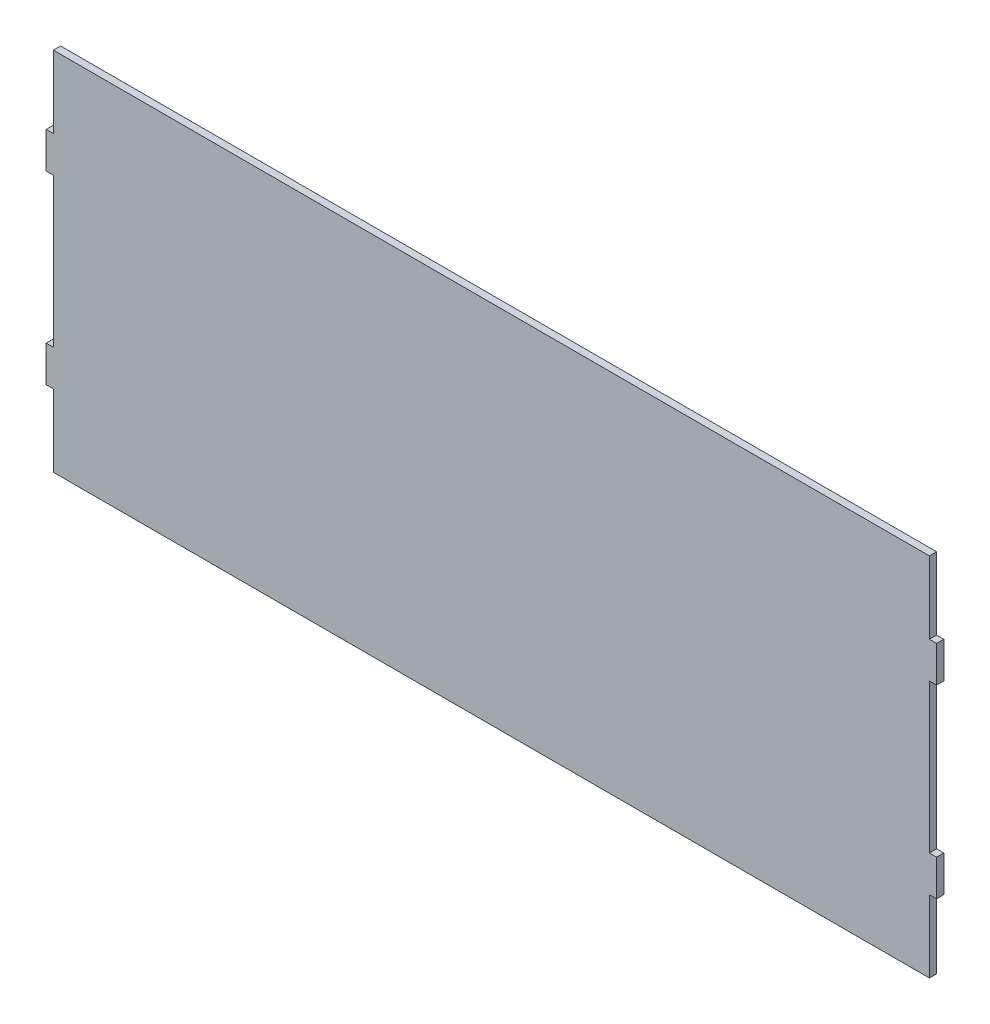
ISO-10303-21;
HEADER;
FILE_DESCRIPTION(('STEP AP214'),'2;1');
FILE_NAME('part.step','',(''),(''),'','','');
FILE_SCHEMA(('AUTOMOTIVE_DESIGN { 1 0 10303 214 1 1 1 1 }'));
ENDSEC;
DATA;
#1=APPLICATION_CONTEXT('core data for automotive mechanical design processes');
#2=APPLICATION_PROTOCOL_DEFINITION('international standard','automotive_design',2000,#1);
#3=PRODUCT_CONTEXT('',#1,'mechanical');
#4=PRODUCT('Part','Part','',(#3));
#5=PRODUCT_RELATED_PRODUCT_CATEGORY('part','',(#4));
#6=PRODUCT_DEFINITION_FORMATION('','',#4);
#7=PRODUCT_DEFINITION_CONTEXT('part definition',#1,'design');
#8=PRODUCT_DEFINITION('design','',#6,#7);
#9=PRODUCT_DEFINITION_SHAPE('','',#8);
#10=(LENGTH_UNIT() NAMED_UNIT(*) SI_UNIT(.MILLI.,.METRE.));
#11=(NAMED_UNIT(*) PLANE_ANGLE_UNIT() SI_UNIT($,.RADIAN.));
#12=(NAMED_UNIT(*) SI_UNIT($,.STERADIAN.) SOLID_ANGLE_UNIT());
#13=UNCERTAINTY_MEASURE_WITH_UNIT(LENGTH_MEASURE(1.E-05),#10,'distance_accuracy_value','');
#14=(GEOMETRIC_REPRESENTATION_CONTEXT(3) GLOBAL_UNCERTAINTY_ASSIGNED_CONTEXT((#13)) GLOBAL_UNIT_ASSIGNED_CONTEXT((#10,
#11,#12)) REPRESENTATION_CONTEXT('',''));
#15=CARTESIAN_POINT('',(0.,0.,0.));
#16=DIRECTION('',(0.,0.,1.));
#17=DIRECTION('',(1.,0.,0.));
#18=AXIS2_PLACEMENT_3D('',#15,#16,#17);
#19=CARTESIAN_POINT('',(0.,0.,3.));
#20=DIRECTION('',(1.,0.,0.));
#21=DIRECTION('',(0.,0.,-1.));
#22=AXIS2_PLACEMENT_3D('',#19,#20,#21);
#23=PLANE('',#22);
#24=DIRECTION('',(0.,-1.,0.));
#25=VECTOR('',#24,1.);
#26=CARTESIAN_POINT('',(0.,0.,0.));
#27=LINE('',#26,#25);
#28=CARTESIAN_POINT('',(0.,29.9999999999999,0.));
#29=VERTEX_POINT('',#28);
#30=CARTESIAN_POINT('',(0.,0.,0.));
#31=VERTEX_POINT('',#30);
#32=EDGE_CURVE('E204',#29,#31,#27,.T.);
#33=ORIENTED_EDGE('',*,*,#32,.T.);
#34=DIRECTION('',(0.,0.,-1.));
#35=VECTOR('',#34,1.);
#36=CARTESIAN_POINT('',(0.,0.,3.));
#37=LINE('',#36,#35);
#38=CARTESIAN_POINT('',(0.,0.,3.));
#39=VERTEX_POINT('',#38);
#40=EDGE_CURVE('E11',#39,#31,#37,.T.);
#41=ORIENTED_EDGE('',*,*,#40,.F.);
#42=DIRECTION('',(0.,-1.,0.));
#43=VECTOR('',#42,1.);
#44=CARTESIAN_POINT('',(0.,0.,3.));
#45=LINE('',#44,#43);
#46=CARTESIAN_POINT('',(0.,29.9999999999999,3.));
#47=VERTEX_POINT('',#46);
#48=EDGE_CURVE('E242',#47,#39,#45,.T.);
#49=ORIENTED_EDGE('',*,*,#48,.F.);
#50=DIRECTION('',(0.,0.,-1.));
#51=VECTOR('',#50,1.);
#52=CARTESIAN_POINT('',(0.,29.9999999999999,3.));
#53=LINE('',#52,#51);
#54=EDGE_CURVE('E200',#47,#29,#53,.T.);
#55=ORIENTED_EDGE('',*,*,#54,.T.);
#56=EDGE_LOOP('',(#33,#41,#49,#55));
#57=FACE_BOUND('',#56,.T.);
#58=ADVANCED_FACE('F36',(#57),#23,.F.);
#59=CARTESIAN_POINT('',(0.,0.,3.));
#60=DIRECTION('',(0.,1.,0.));
#61=DIRECTION('',(-1.,0.,0.));
#62=AXIS2_PLACEMENT_3D('',#59,#60,#61);
#63=PLANE('',#62);
#64=DIRECTION('',(1.,0.,0.));
#65=VECTOR('',#64,1.);
#66=CARTESIAN_POINT('',(0.,0.,0.));
#67=LINE('',#66,#65);
#68=CARTESIAN_POINT('',(364.,0.,0.));
#69=VERTEX_POINT('',#68);
#70=EDGE_CURVE('E207',#31,#69,#67,.T.);
#71=ORIENTED_EDGE('',*,*,#70,.T.);
#72=DIRECTION('',(0.,0.,-1.));
#73=VECTOR('',#72,1.);
#74=CARTESIAN_POINT('',(364.,0.,3.));
#75=LINE('',#74,#73);
#76=CARTESIAN_POINT('',(364.,0.,3.));
#77=VERTEX_POINT('',#76);
#78=EDGE_CURVE('E44',#77,#69,#75,.T.);
#79=ORIENTED_EDGE('',*,*,#78,.F.);
#80=DIRECTION('',(1.,0.,0.));
#81=VECTOR('',#80,1.);
#82=CARTESIAN_POINT('',(0.,0.,3.));
#83=LINE('',#82,#81);
#84=EDGE_CURVE('E131',#39,#77,#83,.T.);
#85=ORIENTED_EDGE('',*,*,#84,.F.);
#86=ORIENTED_EDGE('',*,*,#40,.T.);
#87=EDGE_LOOP('',(#71,#79,#85,#86));
#88=FACE_BOUND('',#87,.T.);
#89=ADVANCED_FACE('F360',(#88),#63,.F.);
#90=CARTESIAN_POINT('',(364.,0.,3.));
#91=DIRECTION('',(-1.,0.,0.));
#92=DIRECTION('',(0.,-1.,0.));
#93=AXIS2_PLACEMENT_3D('',#90,#91,#92);
#94=PLANE('',#93);
#95=DIRECTION('',(0.,1.,0.));
#96=VECTOR('',#95,1.);
#97=CARTESIAN_POINT('',(364.,0.,0.));
#98=LINE('',#97,#96);
#99=CARTESIAN_POINT('',(364.,29.9999999999999,0.));
#100=VERTEX_POINT('',#99);
#101=EDGE_CURVE('E209',#69,#100,#98,.T.);
#102=ORIENTED_EDGE('',*,*,#101,.T.);
#103=DIRECTION('',(0.,0.,-1.));
#104=VECTOR('',#103,1.);
#105=CARTESIAN_POINT('',(364.,29.9999999999999,3.));
#106=LINE('',#105,#104);
#107=CARTESIAN_POINT('',(364.,29.9999999999999,3.));
#108=VERTEX_POINT('',#107);
#109=EDGE_CURVE('E285',#108,#100,#106,.T.);
#110=ORIENTED_EDGE('',*,*,#109,.F.);
#111=DIRECTION('',(0.,1.,0.));
#112=VECTOR('',#111,1.);
#113=CARTESIAN_POINT('',(364.,0.,3.));
#114=LINE('',#113,#112);
#115=EDGE_CURVE('E293',#77,#108,#114,.T.);
#116=ORIENTED_EDGE('',*,*,#115,.F.);
#117=ORIENTED_EDGE('',*,*,#78,.T.);
#118=EDGE_LOOP('',(#102,#110,#116,#117));
#119=FACE_BOUND('',#118,.T.);
#120=ADVANCED_FACE('F291',(#119),#94,.F.);
#121=CARTESIAN_POINT('',(364.,29.9999999999999,3.));
#122=DIRECTION('',(0.,1.,0.));
#123=DIRECTION('',(0.,0.,1.));
#124=AXIS2_PLACEMENT_3D('',#121,#122,#123);
#125=PLANE('',#124);
#126=DIRECTION('',(1.,0.,0.));
#127=VECTOR('',#126,1.);
#128=CARTESIAN_POINT('',(364.,29.9999999999999,0.));
#129=LINE('',#128,#127);
#130=CARTESIAN_POINT('',(367.,29.9999999999999,0.));
#131=VERTEX_POINT('',#130);
#132=EDGE_CURVE('E211',#100,#131,#129,.T.);
#133=ORIENTED_EDGE('',*,*,#132,.T.);
#134=DIRECTION('',(0.,0.,-1.));
#135=VECTOR('',#134,1.);
#136=CARTESIAN_POINT('',(367.,29.9999999999999,3.));
#137=LINE('',#136,#135);
#138=CARTESIAN_POINT('',(367.,29.9999999999999,3.));
#139=VERTEX_POINT('',#138);
#140=EDGE_CURVE('E282',#139,#131,#137,.T.);
#141=ORIENTED_EDGE('',*,*,#140,.F.);
#142=DIRECTION('',(1.,0.,0.));
#143=VECTOR('',#142,1.);
#144=CARTESIAN_POINT('',(364.,29.9999999999999,3.));
#145=LINE('',#144,#143);
#146=EDGE_CURVE('E311',#108,#139,#145,.T.);
#147=ORIENTED_EDGE('',*,*,#146,.F.);
#148=ORIENTED_EDGE('',*,*,#109,.T.);
#149=EDGE_LOOP('',(#133,#141,#147,#148));
#150=FACE_BOUND('',#149,.T.);
#151=ADVANCED_FACE('F302',(#150),#125,.F.);
#152=CARTESIAN_POINT('',(367.,29.9999999999999,3.));
#153=DIRECTION('',(-1.,0.,0.));
#154=DIRECTION('',(0.,0.,1.));
#155=AXIS2_PLACEMENT_3D('',#152,#153,#154);
#156=PLANE('',#155);
#157=DIRECTION('',(0.,1.,0.));
#158=VECTOR('',#157,1.);
#159=CARTESIAN_POINT('',(367.,29.9999999999999,0.));
#160=LINE('',#159,#158);
#161=CARTESIAN_POINT('',(367.,44.9999999999999,0.));
#162=VERTEX_POINT('',#161);
#163=EDGE_CURVE('E213',#131,#162,#160,.T.);
#164=ORIENTED_EDGE('',*,*,#163,.T.);
#165=DIRECTION('',(0.,0.,-1.));
#166=VECTOR('',#165,1.);
#167=CARTESIAN_POINT('',(367.,44.9999999999999,3.));
#168=LINE('',#167,#166);
#169=CARTESIAN_POINT('',(367.,44.9999999999999,3.));
#170=VERTEX_POINT('',#169);
#171=EDGE_CURVE('E279',#170,#162,#168,.T.);
#172=ORIENTED_EDGE('',*,*,#171,.F.);
#173=DIRECTION('',(0.,1.,0.));
#174=VECTOR('',#173,1.);
#175=CARTESIAN_POINT('',(367.,29.9999999999999,3.));
#176=LINE('',#175,#174);
#177=EDGE_CURVE('E308',#139,#170,#176,.T.);
#178=ORIENTED_EDGE('',*,*,#177,.F.);
#179=ORIENTED_EDGE('',*,*,#140,.T.);
#180=EDGE_LOOP('',(#164,#172,#178,#179));
#181=FACE_BOUND('',#180,.T.);
#182=ADVANCED_FACE('F306',(#181),#156,.F.);
#183=CARTESIAN_POINT('',(367.,44.9999999999999,3.));
#184=DIRECTION('',(0.,-1.,0.));
#185=DIRECTION('',(0.,0.,-1.));
#186=AXIS2_PLACEMENT_3D('',#183,#184,#185);
#187=PLANE('',#186);
#188=DIRECTION('',(-1.,0.,0.));
#189=VECTOR('',#188,1.);
#190=CARTESIAN_POINT('',(367.,44.9999999999999,0.));
#191=LINE('',#190,#189);
#192=CARTESIAN_POINT('',(364.,44.9999999999999,0.));
#193=VERTEX_POINT('',#192);
#194=EDGE_CURVE('E215',#162,#193,#191,.T.);
#195=ORIENTED_EDGE('',*,*,#194,.T.);
#196=DIRECTION('',(0.,0.,-1.));
#197=VECTOR('',#196,1.);
#198=CARTESIAN_POINT('',(364.,44.9999999999999,3.));
#199=LINE('',#198,#197);
#200=CARTESIAN_POINT('',(364.,44.9999999999999,3.));
#201=VERTEX_POINT('',#200);
#202=EDGE_CURVE('E276',#201,#193,#199,.T.);
#203=ORIENTED_EDGE('',*,*,#202,.F.);
#204=DIRECTION('',(-1.,0.,0.));
#205=VECTOR('',#204,1.);
#206=CARTESIAN_POINT('',(367.,44.9999999999999,3.));
#207=LINE('',#206,#205);
#208=EDGE_CURVE('E310',#170,#201,#207,.T.);
#209=ORIENTED_EDGE('',*,*,#208,.F.);
#210=ORIENTED_EDGE('',*,*,#171,.T.);
#211=EDGE_LOOP('',(#195,#203,#209,#210));
#212=FACE_BOUND('',#211,.T.);
#213=ADVANCED_FACE('F373',(#212),#187,.F.);
#214=CARTESIAN_POINT('',(364.,44.9999999999999,3.));
#215=DIRECTION('',(-1.,0.,0.));
#216=DIRECTION('',(0.,0.,1.));
#217=AXIS2_PLACEMENT_3D('',#214,#215,#216);
#218=PLANE('',#217);
#219=DIRECTION('',(0.,1.,0.));
#220=VECTOR('',#219,1.);
#221=CARTESIAN_POINT('',(364.,44.9999999999999,0.));
#222=LINE('',#221,#220);
#223=CARTESIAN_POINT('',(364.,106.91,0.));
#224=VERTEX_POINT('',#223);
#225=EDGE_CURVE('E217',#193,#224,#222,.T.);
#226=ORIENTED_EDGE('',*,*,#225,.T.);
#227=DIRECTION('',(0.,0.,-1.));
#228=VECTOR('',#227,1.);
#229=CARTESIAN_POINT('',(364.,106.91,3.));
#230=LINE('',#229,#228);
#231=CARTESIAN_POINT('',(364.,106.91,3.));
#232=VERTEX_POINT('',#231);
#233=EDGE_CURVE('E273',#232,#224,#230,.T.);
#234=ORIENTED_EDGE('',*,*,#233,.F.);
#235=DIRECTION('',(0.,1.,0.));
#236=VECTOR('',#235,1.);
#237=CARTESIAN_POINT('',(364.,44.9999999999999,3.));
#238=LINE('',#237,#236);
#239=EDGE_CURVE('E313',#201,#232,#238,.T.);
#240=ORIENTED_EDGE('',*,*,#239,.F.);
#241=ORIENTED_EDGE('',*,*,#202,.T.);
#242=EDGE_LOOP('',(#226,#234,#240,#241));
#243=FACE_BOUND('',#242,.T.);
#244=ADVANCED_FACE('F376',(#243),#218,.F.);
#245=CARTESIAN_POINT('',(367.,106.91,3.));
#246=DIRECTION('',(0.,1.,0.));
#247=DIRECTION('',(0.,0.,1.));
#248=AXIS2_PLACEMENT_3D('',#245,#246,#247);
#249=PLANE('',#248);
#250=DIRECTION('',(1.,0.,0.));
#251=VECTOR('',#250,1.);
#252=CARTESIAN_POINT('',(367.,106.91,0.));
#253=LINE('',#252,#251);
#254=CARTESIAN_POINT('',(367.,106.91,0.));
#255=VERTEX_POINT('',#254);
#256=EDGE_CURVE('E219',#224,#255,#253,.T.);
#257=ORIENTED_EDGE('',*,*,#256,.T.);
#258=DIRECTION('',(0.,0.,-1.));
#259=VECTOR('',#258,1.);
#260=CARTESIAN_POINT('',(367.,106.91,3.));
#261=LINE('',#260,#259);
#262=CARTESIAN_POINT('',(367.,106.91,3.));
#263=VERTEX_POINT('',#262);
#264=EDGE_CURVE('E270',#263,#255,#261,.T.);
#265=ORIENTED_EDGE('',*,*,#264,.F.);
#266=DIRECTION('',(1.,0.,0.));
#267=VECTOR('',#266,1.);
#268=CARTESIAN_POINT('',(367.,106.91,3.));
#269=LINE('',#268,#267);
#270=EDGE_CURVE('E319',#232,#263,#269,.T.);
#271=ORIENTED_EDGE('',*,*,#270,.F.);
#272=ORIENTED_EDGE('',*,*,#233,.T.);
#273=EDGE_LOOP('',(#257,#265,#271,#272));
#274=FACE_BOUND('',#273,.T.);
#275=ADVANCED_FACE('F380',(#274),#249,.F.);
#276=CARTESIAN_POINT('',(367.,121.91,3.));
#277=DIRECTION('',(-1.,0.,0.));
#278=DIRECTION('',(0.,0.,1.));
#279=AXIS2_PLACEMENT_3D('',#276,#277,#278);
#280=PLANE('',#279);
#281=DIRECTION('',(0.,1.,0.));
#282=VECTOR('',#281,1.);
#283=CARTESIAN_POINT('',(367.,121.91,0.));
#284=LINE('',#283,#282);
#285=CARTESIAN_POINT('',(367.,121.91,0.));
#286=VERTEX_POINT('',#285);
#287=EDGE_CURVE('E221',#255,#286,#284,.T.);
#288=ORIENTED_EDGE('',*,*,#287,.T.);
#289=DIRECTION('',(0.,0.,-1.));
#290=VECTOR('',#289,1.);
#291=CARTESIAN_POINT('',(367.,121.91,3.));
#292=LINE('',#291,#290);
#293=CARTESIAN_POINT('',(367.,121.91,3.));
#294=VERTEX_POINT('',#293);
#295=EDGE_CURVE('E267',#294,#286,#292,.T.);
#296=ORIENTED_EDGE('',*,*,#295,.F.);
#297=DIRECTION('',(0.,1.,0.));
#298=VECTOR('',#297,1.);
#299=CARTESIAN_POINT('',(367.,121.91,3.));
#300=LINE('',#299,#298);
#301=EDGE_CURVE('E321',#263,#294,#300,.T.);
#302=ORIENTED_EDGE('',*,*,#301,.F.);
#303=ORIENTED_EDGE('',*,*,#264,.T.);
#304=EDGE_LOOP('',(#288,#296,#302,#303));
#305=FACE_BOUND('',#304,.T.);
#306=ADVANCED_FACE('F384',(#305),#280,.F.);
#307=CARTESIAN_POINT('',(364.,121.91,3.));
#308=DIRECTION('',(0.,-1.,0.));
#309=DIRECTION('',(0.,0.,-1.));
#310=AXIS2_PLACEMENT_3D('',#307,#308,#309);
#311=PLANE('',#310);
#312=DIRECTION('',(-1.,0.,0.));
#313=VECTOR('',#312,1.);
#314=CARTESIAN_POINT('',(364.,121.91,0.));
#315=LINE('',#314,#313);
#316=CARTESIAN_POINT('',(364.,121.91,0.));
#317=VERTEX_POINT('',#316);
#318=EDGE_CURVE('E223',#286,#317,#315,.T.);
#319=ORIENTED_EDGE('',*,*,#318,.T.);
#320=DIRECTION('',(0.,0.,-1.));
#321=VECTOR('',#320,1.);
#322=CARTESIAN_POINT('',(364.,121.91,3.));
#323=LINE('',#322,#321);
#324=CARTESIAN_POINT('',(364.,121.91,3.));
#325=VERTEX_POINT('',#324);
#326=EDGE_CURVE('E264',#325,#317,#323,.T.);
#327=ORIENTED_EDGE('',*,*,#326,.F.);
#328=DIRECTION('',(-1.,0.,0.));
#329=VECTOR('',#328,1.);
#330=CARTESIAN_POINT('',(364.,121.91,3.));
#331=LINE('',#330,#329);
#332=EDGE_CURVE('E323',#294,#325,#331,.T.);
#333=ORIENTED_EDGE('',*,*,#332,.F.);
#334=ORIENTED_EDGE('',*,*,#295,.T.);
#335=EDGE_LOOP('',(#319,#327,#333,#334));
#336=FACE_BOUND('',#335,.T.);
#337=ADVANCED_FACE('F388',(#336),#311,.F.);
#338=CARTESIAN_POINT('',(364.,121.91,3.));
#339=DIRECTION('',(-1.,0.,0.));
#340=DIRECTION('',(0.,-1.,0.));
#341=AXIS2_PLACEMENT_3D('',#338,#339,#340);
#342=PLANE('',#341);
#343=DIRECTION('',(0.,1.,0.));
#344=VECTOR('',#343,1.);
#345=CARTESIAN_POINT('',(364.,121.91,0.));
#346=LINE('',#345,#344);
#347=CARTESIAN_POINT('',(364.,151.91,0.));
#348=VERTEX_POINT('',#347);
#349=EDGE_CURVE('E225',#317,#348,#346,.T.);
#350=ORIENTED_EDGE('',*,*,#349,.T.);
#351=DIRECTION('',(0.,0.,-1.));
#352=VECTOR('',#351,1.);
#353=CARTESIAN_POINT('',(364.,151.91,3.));
#354=LINE('',#353,#352);
#355=CARTESIAN_POINT('',(364.,151.91,3.));
#356=VERTEX_POINT('',#355);
#357=EDGE_CURVE('E261',#356,#348,#354,.T.);
#358=ORIENTED_EDGE('',*,*,#357,.F.);
#359=DIRECTION('',(0.,1.,0.));
#360=VECTOR('',#359,1.);
#361=CARTESIAN_POINT('',(364.,121.91,3.));
#362=LINE('',#361,#360);
#363=EDGE_CURVE('E325',#325,#356,#362,.T.);
#364=ORIENTED_EDGE('',*,*,#363,.F.);
#365=ORIENTED_EDGE('',*,*,#326,.T.);
#366=EDGE_LOOP('',(#350,#358,#364,#365));
#367=FACE_BOUND('',#366,.T.);
#368=ADVANCED_FACE('F392',(#367),#342,.F.);
#369=CARTESIAN_POINT('',(0.,151.91,3.));
#370=DIRECTION('',(0.,-1.,0.));
#371=DIRECTION('',(1.,0.,0.));
#372=AXIS2_PLACEMENT_3D('',#369,#370,#371);
#373=PLANE('',#372);
#374=DIRECTION('',(-1.,0.,0.));
#375=VECTOR('',#374,1.);
#376=CARTESIAN_POINT('',(0.,151.91,0.));
#377=LINE('',#376,#375);
#378=CARTESIAN_POINT('',(0.,151.91,0.));
#379=VERTEX_POINT('',#378);
#380=EDGE_CURVE('E227',#348,#379,#377,.T.);
#381=ORIENTED_EDGE('',*,*,#380,.T.);
#382=DIRECTION('',(0.,0.,-1.));
#383=VECTOR('',#382,1.);
#384=CARTESIAN_POINT('',(0.,151.91,3.));
#385=LINE('',#384,#383);
#386=CARTESIAN_POINT('',(0.,151.91,3.));
#387=VERTEX_POINT('',#386);
#388=EDGE_CURVE('E258',#387,#379,#385,.T.);
#389=ORIENTED_EDGE('',*,*,#388,.F.);
#390=DIRECTION('',(-1.,0.,0.));
#391=VECTOR('',#390,1.);
#392=CARTESIAN_POINT('',(0.,151.91,3.));
#393=LINE('',#392,#391);
#394=EDGE_CURVE('E327',#356,#387,#393,.T.);
#395=ORIENTED_EDGE('',*,*,#394,.F.);
#396=ORIENTED_EDGE('',*,*,#357,.T.);
#397=EDGE_LOOP('',(#381,#389,#395,#396));
#398=FACE_BOUND('',#397,.T.);
#399=ADVANCED_FACE('F396',(#398),#373,.F.);
#400=CARTESIAN_POINT('',(0.,121.91,3.));
#401=DIRECTION('',(1.,0.,0.));
#402=DIRECTION('',(0.,0.,-1.));
#403=AXIS2_PLACEMENT_3D('',#400,#401,#402);
#404=PLANE('',#403);
#405=DIRECTION('',(0.,-1.,0.));
#406=VECTOR('',#405,1.);
#407=CARTESIAN_POINT('',(0.,121.91,0.));
#408=LINE('',#407,#406);
#409=CARTESIAN_POINT('',(0.,121.91,0.));
#410=VERTEX_POINT('',#409);
#411=EDGE_CURVE('E229',#379,#410,#408,.T.);
#412=ORIENTED_EDGE('',*,*,#411,.T.);
#413=DIRECTION('',(0.,0.,-1.));
#414=VECTOR('',#413,1.);
#415=CARTESIAN_POINT('',(0.,121.91,3.));
#416=LINE('',#415,#414);
#417=CARTESIAN_POINT('',(0.,121.91,3.));
#418=VERTEX_POINT('',#417);
#419=EDGE_CURVE('E255',#418,#410,#416,.T.);
#420=ORIENTED_EDGE('',*,*,#419,.F.);
#421=DIRECTION('',(0.,-1.,0.));
#422=VECTOR('',#421,1.);
#423=CARTESIAN_POINT('',(0.,121.91,3.));
#424=LINE('',#423,#422);
#425=EDGE_CURVE('E329',#387,#418,#424,.T.);
#426=ORIENTED_EDGE('',*,*,#425,.F.);
#427=ORIENTED_EDGE('',*,*,#388,.T.);
#428=EDGE_LOOP('',(#412,#420,#426,#427));
#429=FACE_BOUND('',#428,.T.);
#430=ADVANCED_FACE('F400',(#429),#404,.F.);
#431=CARTESIAN_POINT('',(0.,121.91,3.));
#432=DIRECTION('',(0.,-1.,0.));
#433=DIRECTION('',(0.,0.,-1.));
#434=AXIS2_PLACEMENT_3D('',#431,#432,#433);
#435=PLANE('',#434);
#436=DIRECTION('',(-1.,0.,0.));
#437=VECTOR('',#436,1.);
#438=CARTESIAN_POINT('',(0.,121.91,0.));
#439=LINE('',#438,#437);
#440=CARTESIAN_POINT('',(-3.,121.91,0.));
#441=VERTEX_POINT('',#440);
#442=EDGE_CURVE('E231',#410,#441,#439,.T.);
#443=ORIENTED_EDGE('',*,*,#442,.T.);
#444=DIRECTION('',(0.,0.,-1.));
#445=VECTOR('',#444,1.);
#446=CARTESIAN_POINT('',(-3.,121.91,3.));
#447=LINE('',#446,#445);
#448=CARTESIAN_POINT('',(-3.,121.91,3.));
#449=VERTEX_POINT('',#448);
#450=EDGE_CURVE('E252',#449,#441,#447,.T.);
#451=ORIENTED_EDGE('',*,*,#450,.F.);
#452=DIRECTION('',(-1.,0.,0.));
#453=VECTOR('',#452,1.);
#454=CARTESIAN_POINT('',(0.,121.91,3.));
#455=LINE('',#454,#453);
#456=EDGE_CURVE('E331',#418,#449,#455,.T.);
#457=ORIENTED_EDGE('',*,*,#456,.F.);
#458=ORIENTED_EDGE('',*,*,#419,.T.);
#459=EDGE_LOOP('',(#443,#451,#457,#458));
#460=FACE_BOUND('',#459,.T.);
#461=ADVANCED_FACE('F404',(#460),#435,.F.);
#462=CARTESIAN_POINT('',(-3.,121.91,3.));
#463=DIRECTION('',(1.,0.,0.));
#464=DIRECTION('',(0.,0.,-1.));
#465=AXIS2_PLACEMENT_3D('',#462,#463,#464);
#466=PLANE('',#465);
#467=DIRECTION('',(0.,-1.,0.));
#468=VECTOR('',#467,1.);
#469=CARTESIAN_POINT('',(-3.,121.91,0.));
#470=LINE('',#469,#468);
#471=CARTESIAN_POINT('',(-3.,106.91,0.));
#472=VERTEX_POINT('',#471);
#473=EDGE_CURVE('E233',#441,#472,#470,.T.);
#474=ORIENTED_EDGE('',*,*,#473,.T.);
#475=DIRECTION('',(0.,0.,-1.));
#476=VECTOR('',#475,1.);
#477=CARTESIAN_POINT('',(-3.,106.91,3.));
#478=LINE('',#477,#476);
#479=CARTESIAN_POINT('',(-3.,106.91,3.));
#480=VERTEX_POINT('',#479);
#481=EDGE_CURVE('E249',#480,#472,#478,.T.);
#482=ORIENTED_EDGE('',*,*,#481,.F.);
#483=DIRECTION('',(0.,-1.,0.));
#484=VECTOR('',#483,1.);
#485=CARTESIAN_POINT('',(-3.,121.91,3.));
#486=LINE('',#485,#484);
#487=EDGE_CURVE('E333',#449,#480,#486,.T.);
#488=ORIENTED_EDGE('',*,*,#487,.F.);
#489=ORIENTED_EDGE('',*,*,#450,.T.);
#490=EDGE_LOOP('',(#474,#482,#488,#489));
#491=FACE_BOUND('',#490,.T.);
#492=ADVANCED_FACE('F408',(#491),#466,.F.);
#493=CARTESIAN_POINT('',(-3.,106.91,3.));
#494=DIRECTION('',(0.,1.,0.));
#495=DIRECTION('',(0.,0.,1.));
#496=AXIS2_PLACEMENT_3D('',#493,#494,#495);
#497=PLANE('',#496);
#498=DIRECTION('',(1.,0.,0.));
#499=VECTOR('',#498,1.);
#500=CARTESIAN_POINT('',(-3.,106.91,0.));
#501=LINE('',#500,#499);
#502=CARTESIAN_POINT('',(0.,106.91,0.));
#503=VERTEX_POINT('',#502);
#504=EDGE_CURVE('E235',#472,#503,#501,.T.);
#505=ORIENTED_EDGE('',*,*,#504,.T.);
#506=DIRECTION('',(0.,0.,-1.));
#507=VECTOR('',#506,1.);
#508=CARTESIAN_POINT('',(0.,106.91,3.));
#509=LINE('',#508,#507);
#510=CARTESIAN_POINT('',(0.,106.91,3.));
#511=VERTEX_POINT('',#510);
#512=EDGE_CURVE('E246',#511,#503,#509,.T.);
#513=ORIENTED_EDGE('',*,*,#512,.F.);
#514=DIRECTION('',(1.,0.,0.));
#515=VECTOR('',#514,1.);
#516=CARTESIAN_POINT('',(-3.,106.91,3.));
#517=LINE('',#516,#515);
#518=EDGE_CURVE('E335',#480,#511,#517,.T.);
#519=ORIENTED_EDGE('',*,*,#518,.F.);
#520=ORIENTED_EDGE('',*,*,#481,.T.);
#521=EDGE_LOOP('',(#505,#513,#519,#520));
#522=FACE_BOUND('',#521,.T.);
#523=ADVANCED_FACE('F341',(#522),#497,.F.);
#524=CARTESIAN_POINT('',(0.,44.9999999999999,3.));
#525=DIRECTION('',(1.,0.,0.));
#526=DIRECTION('',(0.,0.,-1.));
#527=AXIS2_PLACEMENT_3D('',#524,#525,#526);
#528=PLANE('',#527);
#529=DIRECTION('',(0.,-1.,0.));
#530=VECTOR('',#529,1.);
#531=CARTESIAN_POINT('',(0.,44.9999999999999,0.));
#532=LINE('',#531,#530);
#533=CARTESIAN_POINT('',(0.,44.9999999999999,0.));
#534=VERTEX_POINT('',#533);
#535=EDGE_CURVE('E237',#503,#534,#532,.T.);
#536=ORIENTED_EDGE('',*,*,#535,.T.);
#537=DIRECTION('',(0.,0.,-1.));
#538=VECTOR('',#537,1.);
#539=CARTESIAN_POINT('',(0.,44.9999999999999,3.));
#540=LINE('',#539,#538);
#541=CARTESIAN_POINT('',(0.,44.9999999999999,3.));
#542=VERTEX_POINT('',#541);
#543=EDGE_CURVE('E195',#542,#534,#540,.T.);
#544=ORIENTED_EDGE('',*,*,#543,.F.);
#545=DIRECTION('',(0.,-1.,0.));
#546=VECTOR('',#545,1.);
#547=CARTESIAN_POINT('',(0.,44.9999999999999,3.));
#548=LINE('',#547,#546);
#549=EDGE_CURVE('E186',#511,#542,#548,.T.);
#550=ORIENTED_EDGE('',*,*,#549,.F.);
#551=ORIENTED_EDGE('',*,*,#512,.T.);
#552=EDGE_LOOP('',(#536,#544,#550,#551));
#553=FACE_BOUND('',#552,.T.);
#554=ADVANCED_FACE('F345',(#553),#528,.F.);
#555=CARTESIAN_POINT('',(-3.,44.9999999999999,3.));
#556=DIRECTION('',(0.,-1.,0.));
#557=DIRECTION('',(0.,0.,-1.));
#558=AXIS2_PLACEMENT_3D('',#555,#556,#557);
#559=PLANE('',#558);
#560=DIRECTION('',(-1.,0.,0.));
#561=VECTOR('',#560,1.);
#562=CARTESIAN_POINT('',(-3.,44.9999999999999,0.));
#563=LINE('',#562,#561);
#564=CARTESIAN_POINT('',(-3.,44.9999999999999,0.));
#565=VERTEX_POINT('',#564);
#566=EDGE_CURVE('E194',#534,#565,#563,.T.);
#567=ORIENTED_EDGE('',*,*,#566,.T.);
#568=DIRECTION('',(0.,0.,-1.));
#569=VECTOR('',#568,1.);
#570=CARTESIAN_POINT('',(-3.,44.9999999999999,3.));
#571=LINE('',#570,#569);
#572=CARTESIAN_POINT('',(-3.,44.9999999999999,3.));
#573=VERTEX_POINT('',#572);
#574=EDGE_CURVE('E191',#573,#565,#571,.T.);
#575=ORIENTED_EDGE('',*,*,#574,.F.);
#576=DIRECTION('',(-1.,0.,0.));
#577=VECTOR('',#576,1.);
#578=CARTESIAN_POINT('',(-3.,44.9999999999999,3.));
#579=LINE('',#578,#577);
#580=EDGE_CURVE('E180',#542,#573,#579,.T.);
#581=ORIENTED_EDGE('',*,*,#580,.F.);
#582=ORIENTED_EDGE('',*,*,#543,.T.);
#583=EDGE_LOOP('',(#567,#575,#581,#582));
#584=FACE_BOUND('',#583,.T.);
#585=ADVANCED_FACE('F192',(#584),#559,.F.);
#586=CARTESIAN_POINT('',(-3.,29.9999999999999,3.));
#587=DIRECTION('',(1.,0.,0.));
#588=DIRECTION('',(0.,0.,-1.));
#589=AXIS2_PLACEMENT_3D('',#586,#587,#588);
#590=PLANE('',#589);
#591=DIRECTION('',(0.,-1.,0.));
#592=VECTOR('',#591,1.);
#593=CARTESIAN_POINT('',(-3.,29.9999999999999,0.));
#594=LINE('',#593,#592);
#595=CARTESIAN_POINT('',(-3.,29.9999999999999,0.));
#596=VERTEX_POINT('',#595);
#597=EDGE_CURVE('E117',#565,#596,#594,.T.);
#598=ORIENTED_EDGE('',*,*,#597,.T.);
#599=DIRECTION('',(0.,0.,-1.));
#600=VECTOR('',#599,1.);
#601=CARTESIAN_POINT('',(-3.,29.9999999999999,3.));
#602=LINE('',#601,#600);
#603=CARTESIAN_POINT('',(-3.,29.9999999999999,3.));
#604=VERTEX_POINT('',#603);
#605=EDGE_CURVE('E196',#604,#596,#602,.T.);
#606=ORIENTED_EDGE('',*,*,#605,.F.);
#607=DIRECTION('',(0.,-1.,0.));
#608=VECTOR('',#607,1.);
#609=CARTESIAN_POINT('',(-3.,29.9999999999999,3.));
#610=LINE('',#609,#608);
#611=EDGE_CURVE('E184',#573,#604,#610,.T.);
#612=ORIENTED_EDGE('',*,*,#611,.F.);
#613=ORIENTED_EDGE('',*,*,#574,.T.);
#614=EDGE_LOOP('',(#598,#606,#612,#613));
#615=FACE_BOUND('',#614,.T.);
#616=ADVANCED_FACE('F198',(#615),#590,.F.);
#617=CARTESIAN_POINT('',(0.,29.9999999999999,3.));
#618=DIRECTION('',(0.,1.,0.));
#619=DIRECTION('',(0.,0.,1.));
#620=AXIS2_PLACEMENT_3D('',#617,#618,#619);
#621=PLANE('',#620);
#622=DIRECTION('',(1.,0.,0.));
#623=VECTOR('',#622,1.);
#624=CARTESIAN_POINT('',(0.,29.9999999999999,0.));
#625=LINE('',#624,#623);
#626=EDGE_CURVE('E123',#596,#29,#625,.T.);
#627=ORIENTED_EDGE('',*,*,#626,.T.);
#628=ORIENTED_EDGE('',*,*,#54,.F.);
#629=DIRECTION('',(1.,0.,0.));
#630=VECTOR('',#629,1.);
#631=CARTESIAN_POINT('',(0.,29.9999999999999,3.));
#632=LINE('',#631,#630);
#633=EDGE_CURVE('E52',#604,#47,#632,.T.);
#634=ORIENTED_EDGE('',*,*,#633,.F.);
#635=ORIENTED_EDGE('',*,*,#605,.T.);
#636=EDGE_LOOP('',(#627,#628,#634,#635));
#637=FACE_BOUND('',#636,.T.);
#638=ADVANCED_FACE('F349',(#637),#621,.F.);
#639=CARTESIAN_POINT('',(0.,0.,3.));
#640=DIRECTION('',(0.,0.,1.));
#641=DIRECTION('',(1.,0.,0.));
#642=AXIS2_PLACEMENT_3D('',#639,#640,#641);
#643=PLANE('',#642);
#644=ORIENTED_EDGE('',*,*,#48,.T.);
#645=ORIENTED_EDGE('',*,*,#84,.T.);
#646=ORIENTED_EDGE('',*,*,#115,.T.);
#647=ORIENTED_EDGE('',*,*,#146,.T.);
#648=ORIENTED_EDGE('',*,*,#177,.T.);
#649=ORIENTED_EDGE('',*,*,#208,.T.);
#650=ORIENTED_EDGE('',*,*,#239,.T.);
#651=ORIENTED_EDGE('',*,*,#270,.T.);
#652=ORIENTED_EDGE('',*,*,#301,.T.);
#653=ORIENTED_EDGE('',*,*,#332,.T.);
#654=ORIENTED_EDGE('',*,*,#363,.T.);
#655=ORIENTED_EDGE('',*,*,#394,.T.);
#656=ORIENTED_EDGE('',*,*,#425,.T.);
#657=ORIENTED_EDGE('',*,*,#456,.T.);
#658=ORIENTED_EDGE('',*,*,#487,.T.);
#659=ORIENTED_EDGE('',*,*,#518,.T.);
#660=ORIENTED_EDGE('',*,*,#549,.T.);
#661=ORIENTED_EDGE('',*,*,#580,.T.);
#662=ORIENTED_EDGE('',*,*,#611,.T.);
#663=ORIENTED_EDGE('',*,*,#633,.T.);
#664=EDGE_LOOP('',(#644,#645,#646,#647,#648,#649,#650,#651,#652,#653,#654,#655,#656,#657,#658,
#659,#660,#661,#662,#663));
#665=FACE_BOUND('',#664,.T.);
#666=ADVANCED_FACE('F182',(#665),#643,.T.);
#667=CARTESIAN_POINT('',(0.,0.,0.));
#668=DIRECTION('',(0.,0.,1.));
#669=DIRECTION('',(1.,0.,0.));
#670=AXIS2_PLACEMENT_3D('',#667,#668,#669);
#671=PLANE('',#670);
#672=ORIENTED_EDGE('',*,*,#32,.F.);
#673=ORIENTED_EDGE('',*,*,#626,.F.);
#674=ORIENTED_EDGE('',*,*,#597,.F.);
#675=ORIENTED_EDGE('',*,*,#566,.F.);
#676=ORIENTED_EDGE('',*,*,#535,.F.);
#677=ORIENTED_EDGE('',*,*,#504,.F.);
#678=ORIENTED_EDGE('',*,*,#473,.F.);
#679=ORIENTED_EDGE('',*,*,#442,.F.);
#680=ORIENTED_EDGE('',*,*,#411,.F.);
#681=ORIENTED_EDGE('',*,*,#380,.F.);
#682=ORIENTED_EDGE('',*,*,#349,.F.);
#683=ORIENTED_EDGE('',*,*,#318,.F.);
#684=ORIENTED_EDGE('',*,*,#287,.F.);
#685=ORIENTED_EDGE('',*,*,#256,.F.);
#686=ORIENTED_EDGE('',*,*,#225,.F.);
#687=ORIENTED_EDGE('',*,*,#194,.F.);
#688=ORIENTED_EDGE('',*,*,#163,.F.);
#689=ORIENTED_EDGE('',*,*,#132,.F.);
#690=ORIENTED_EDGE('',*,*,#101,.F.);
#691=ORIENTED_EDGE('',*,*,#70,.F.);
#692=EDGE_LOOP('',(#672,#673,#674,#675,#676,#677,#678,#679,#680,#681,#682,#683,#684,#685,#686,
#687,#688,#689,#690,#691));
#693=FACE_BOUND('',#692,.T.);
#694=ADVANCED_FACE('F297',(#693),#671,.F.);
#695=CLOSED_SHELL('',(#58,#89,#120,#151,#182,#213,#244,#275,#306,#337,#368,#399,#430,#461,#492,
#523,#554,#585,#616,#638,#666,#694));
#696=MANIFOLD_SOLID_BREP('B2',#695);
#697=ADVANCED_BREP_SHAPE_REPRESENTATION('',(#18,#696),#14);
#698=SHAPE_DEFINITION_REPRESENTATION(#9,#697);
ENDSEC;
END-ISO-10303-21;
